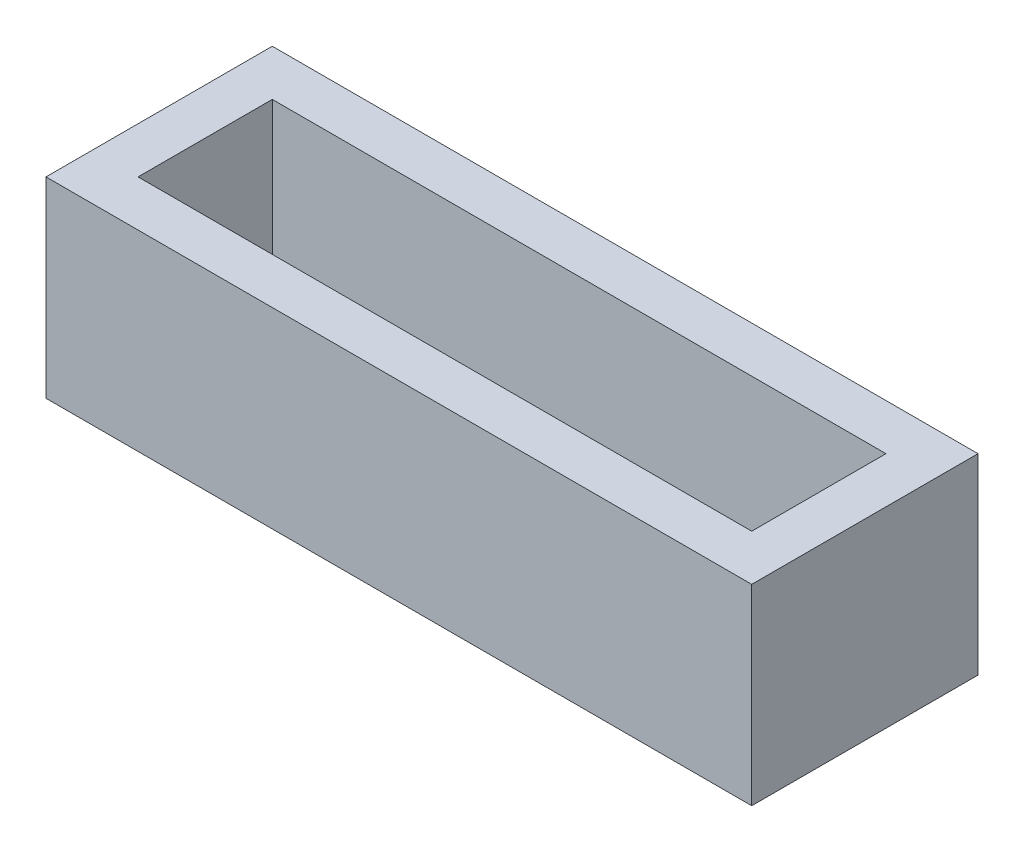
ISO-10303-21;
HEADER;
FILE_DESCRIPTION(('STEP AP214'),'2;1');
FILE_NAME('part.step','',(''),(''),'','','');
FILE_SCHEMA(('AUTOMOTIVE_DESIGN { 1 0 10303 214 1 1 1 1 }'));
ENDSEC;
DATA;
#1=APPLICATION_CONTEXT('core data for automotive mechanical design processes');
#2=APPLICATION_PROTOCOL_DEFINITION('international standard','automotive_design',2000,#1);
#3=PRODUCT_CONTEXT('',#1,'mechanical');
#4=PRODUCT('Part','Part','',(#3));
#5=PRODUCT_RELATED_PRODUCT_CATEGORY('part','',(#4));
#6=PRODUCT_DEFINITION_FORMATION('','',#4);
#7=PRODUCT_DEFINITION_CONTEXT('part definition',#1,'design');
#8=PRODUCT_DEFINITION('design','',#6,#7);
#9=PRODUCT_DEFINITION_SHAPE('','',#8);
#10=(LENGTH_UNIT() NAMED_UNIT(*) SI_UNIT(.MILLI.,.METRE.));
#11=(NAMED_UNIT(*) PLANE_ANGLE_UNIT() SI_UNIT($,.RADIAN.));
#12=(NAMED_UNIT(*) SI_UNIT($,.STERADIAN.) SOLID_ANGLE_UNIT());
#13=UNCERTAINTY_MEASURE_WITH_UNIT(LENGTH_MEASURE(1.E-05),#10,'distance_accuracy_value','');
#14=(GEOMETRIC_REPRESENTATION_CONTEXT(3) GLOBAL_UNCERTAINTY_ASSIGNED_CONTEXT((#13)) GLOBAL_UNIT_ASSIGNED_CONTEXT((#10,
#11,#12)) REPRESENTATION_CONTEXT('',''));
#15=CARTESIAN_POINT('',(0.,0.,0.));
#16=DIRECTION('',(0.,0.,1.));
#17=DIRECTION('',(1.,0.,0.));
#18=AXIS2_PLACEMENT_3D('',#15,#16,#17);
#19=CARTESIAN_POINT('',(0.,5.,0.));
#20=DIRECTION('',(0.,-1.,0.));
#21=DIRECTION('',(0.,0.,-1.));
#22=AXIS2_PLACEMENT_3D('',#19,#20,#21);
#23=PLANE('',#22);
#24=DIRECTION('',(-1.,0.,0.));
#25=VECTOR('',#24,1.);
#26=CARTESIAN_POINT('',(-9.2,5.,-2.95));
#27=LINE('',#26,#25);
#28=CARTESIAN_POINT('',(9.19999999999999,5.,-2.95));
#29=VERTEX_POINT('',#28);
#30=CARTESIAN_POINT('',(-9.2,5.,-2.95));
#31=VERTEX_POINT('',#30);
#32=EDGE_CURVE('E153',#29,#31,#27,.T.);
#33=ORIENTED_EDGE('',*,*,#32,.T.);
#34=DIRECTION('',(0.,0.,1.));
#35=VECTOR('',#34,1.);
#36=CARTESIAN_POINT('',(-9.2,5.,-2.95));
#37=LINE('',#36,#35);
#38=CARTESIAN_POINT('',(-9.2,5.,2.95));
#39=VERTEX_POINT('',#38);
#40=EDGE_CURVE('E157',#31,#39,#37,.T.);
#41=ORIENTED_EDGE('',*,*,#40,.T.);
#42=DIRECTION('',(1.,0.,0.));
#43=VECTOR('',#42,1.);
#44=CARTESIAN_POINT('',(-9.2,5.,2.95));
#45=LINE('',#44,#43);
#46=CARTESIAN_POINT('',(9.19999999999999,5.,2.95));
#47=VERTEX_POINT('',#46);
#48=EDGE_CURVE('E161',#39,#47,#45,.T.);
#49=ORIENTED_EDGE('',*,*,#48,.T.);
#50=DIRECTION('',(0.,0.,-1.));
#51=VECTOR('',#50,1.);
#52=CARTESIAN_POINT('',(9.19999999999999,5.,-2.95));
#53=LINE('',#52,#51);
#54=EDGE_CURVE('E164',#47,#29,#53,.T.);
#55=ORIENTED_EDGE('',*,*,#54,.T.);
#56=EDGE_LOOP('',(#33,#41,#49,#55));
#57=FACE_BOUND('',#56,.T.);
#58=DIRECTION('',(0.,0.,-1.));
#59=VECTOR('',#58,1.);
#60=CARTESIAN_POINT('',(7.99999999999999,5.,-1.75));
#61=LINE('',#60,#59);
#62=CARTESIAN_POINT('',(7.99999999999999,5.,1.75));
#63=VERTEX_POINT('',#62);
#64=CARTESIAN_POINT('',(7.99999999999999,5.,-1.75));
#65=VERTEX_POINT('',#64);
#66=EDGE_CURVE('E105',#63,#65,#61,.T.);
#67=ORIENTED_EDGE('',*,*,#66,.F.);
#68=DIRECTION('',(1.,0.,0.));
#69=VECTOR('',#68,1.);
#70=CARTESIAN_POINT('',(-8.,5.,1.75));
#71=LINE('',#70,#69);
#72=CARTESIAN_POINT('',(-8.,5.,1.75));
#73=VERTEX_POINT('',#72);
#74=EDGE_CURVE('E131',#73,#63,#71,.T.);
#75=ORIENTED_EDGE('',*,*,#74,.F.);
#76=DIRECTION('',(0.,0.,1.));
#77=VECTOR('',#76,1.);
#78=CARTESIAN_POINT('',(-8.,5.,-1.75));
#79=LINE('',#78,#77);
#80=CARTESIAN_POINT('',(-8.,5.,-1.75));
#81=VERTEX_POINT('',#80);
#82=EDGE_CURVE('E127',#81,#73,#79,.T.);
#83=ORIENTED_EDGE('',*,*,#82,.F.);
#84=DIRECTION('',(-1.,0.,0.));
#85=VECTOR('',#84,1.);
#86=CARTESIAN_POINT('',(-8.,5.,-1.75));
#87=LINE('',#86,#85);
#88=EDGE_CURVE('E114',#65,#81,#87,.T.);
#89=ORIENTED_EDGE('',*,*,#88,.F.);
#90=EDGE_LOOP('',(#67,#75,#83,#89));
#91=FACE_BOUND('',#90,.T.);
#92=ADVANCED_FACE('F39',(#57,#91),#23,.F.);
#93=CARTESIAN_POINT('',(0.,0.,0.));
#94=DIRECTION('',(0.,-1.,0.));
#95=DIRECTION('',(0.,0.,-1.));
#96=AXIS2_PLACEMENT_3D('',#93,#94,#95);
#97=PLANE('',#96);
#98=DIRECTION('',(-1.,0.,0.));
#99=VECTOR('',#98,1.);
#100=CARTESIAN_POINT('',(-9.2,0.,-2.95));
#101=LINE('',#100,#99);
#102=CARTESIAN_POINT('',(9.19999999999999,0.,-2.95));
#103=VERTEX_POINT('',#102);
#104=CARTESIAN_POINT('',(-9.2,0.,-2.95));
#105=VERTEX_POINT('',#104);
#106=EDGE_CURVE('E123',#103,#105,#101,.T.);
#107=ORIENTED_EDGE('',*,*,#106,.F.);
#108=DIRECTION('',(0.,0.,-1.));
#109=VECTOR('',#108,1.);
#110=CARTESIAN_POINT('',(9.19999999999999,0.,-2.95));
#111=LINE('',#110,#109);
#112=CARTESIAN_POINT('',(9.19999999999999,0.,2.95));
#113=VERTEX_POINT('',#112);
#114=EDGE_CURVE('E158',#113,#103,#111,.T.);
#115=ORIENTED_EDGE('',*,*,#114,.F.);
#116=DIRECTION('',(1.,0.,0.));
#117=VECTOR('',#116,1.);
#118=CARTESIAN_POINT('',(-9.2,0.,2.95));
#119=LINE('',#118,#117);
#120=CARTESIAN_POINT('',(-9.2,0.,2.95));
#121=VERTEX_POINT('',#120);
#122=EDGE_CURVE('E174',#121,#113,#119,.T.);
#123=ORIENTED_EDGE('',*,*,#122,.F.);
#124=DIRECTION('',(0.,0.,1.));
#125=VECTOR('',#124,1.);
#126=CARTESIAN_POINT('',(-9.2,0.,-2.95));
#127=LINE('',#126,#125);
#128=EDGE_CURVE('E171',#105,#121,#127,.T.);
#129=ORIENTED_EDGE('',*,*,#128,.F.);
#130=EDGE_LOOP('',(#107,#115,#123,#129));
#131=FACE_BOUND('',#130,.T.);
#132=DIRECTION('',(1.,0.,0.));
#133=VECTOR('',#132,1.);
#134=CARTESIAN_POINT('',(-8.,0.,1.75));
#135=LINE('',#134,#133);
#136=CARTESIAN_POINT('',(-8.,0.,1.75));
#137=VERTEX_POINT('',#136);
#138=CARTESIAN_POINT('',(7.99999999999999,0.,1.75));
#139=VERTEX_POINT('',#138);
#140=EDGE_CURVE('E115',#137,#139,#135,.T.);
#141=ORIENTED_EDGE('',*,*,#140,.T.);
#142=DIRECTION('',(0.,0.,-1.));
#143=VECTOR('',#142,1.);
#144=CARTESIAN_POINT('',(7.99999999999999,0.,-1.75));
#145=LINE('',#144,#143);
#146=CARTESIAN_POINT('',(7.99999999999999,0.,-1.75));
#147=VERTEX_POINT('',#146);
#148=EDGE_CURVE('E63',#139,#147,#145,.T.);
#149=ORIENTED_EDGE('',*,*,#148,.T.);
#150=DIRECTION('',(-1.,0.,0.));
#151=VECTOR('',#150,1.);
#152=CARTESIAN_POINT('',(-8.,0.,-1.75));
#153=LINE('',#152,#151);
#154=CARTESIAN_POINT('',(-8.,0.,-1.75));
#155=VERTEX_POINT('',#154);
#156=EDGE_CURVE('E121',#147,#155,#153,.T.);
#157=ORIENTED_EDGE('',*,*,#156,.T.);
#158=DIRECTION('',(0.,0.,1.));
#159=VECTOR('',#158,1.);
#160=CARTESIAN_POINT('',(-8.,0.,-1.75));
#161=LINE('',#160,#159);
#162=EDGE_CURVE('E140',#155,#137,#161,.T.);
#163=ORIENTED_EDGE('',*,*,#162,.T.);
#164=EDGE_LOOP('',(#141,#149,#157,#163));
#165=FACE_BOUND('',#164,.T.);
#166=ADVANCED_FACE('F197',(#131,#165),#97,.T.);
#167=CARTESIAN_POINT('',(-9.2,5.,-2.95));
#168=DIRECTION('',(0.,0.,1.));
#169=DIRECTION('',(1.,0.,0.));
#170=AXIS2_PLACEMENT_3D('',#167,#168,#169);
#171=PLANE('',#170);
#172=ORIENTED_EDGE('',*,*,#106,.T.);
#173=DIRECTION('',(0.,-1.,0.));
#174=VECTOR('',#173,1.);
#175=CARTESIAN_POINT('',(-9.2,5.,-2.95));
#176=LINE('',#175,#174);
#177=EDGE_CURVE('E11',#31,#105,#176,.T.);
#178=ORIENTED_EDGE('',*,*,#177,.F.);
#179=ORIENTED_EDGE('',*,*,#32,.F.);
#180=DIRECTION('',(0.,-1.,0.));
#181=VECTOR('',#180,1.);
#182=CARTESIAN_POINT('',(9.19999999999999,5.,-2.95));
#183=LINE('',#182,#181);
#184=EDGE_CURVE('E167',#29,#103,#183,.T.);
#185=ORIENTED_EDGE('',*,*,#184,.T.);
#186=EDGE_LOOP('',(#172,#178,#179,#185));
#187=FACE_BOUND('',#186,.T.);
#188=ADVANCED_FACE('F41',(#187),#171,.F.);
#189=CARTESIAN_POINT('',(-9.2,5.,-2.95));
#190=DIRECTION('',(1.,0.,0.));
#191=DIRECTION('',(0.,0.,-1.));
#192=AXIS2_PLACEMENT_3D('',#189,#190,#191);
#193=PLANE('',#192);
#194=ORIENTED_EDGE('',*,*,#128,.T.);
#195=DIRECTION('',(0.,-1.,0.));
#196=VECTOR('',#195,1.);
#197=CARTESIAN_POINT('',(-9.2,5.,2.95));
#198=LINE('',#197,#196);
#199=EDGE_CURVE('E48',#39,#121,#198,.T.);
#200=ORIENTED_EDGE('',*,*,#199,.F.);
#201=ORIENTED_EDGE('',*,*,#40,.F.);
#202=ORIENTED_EDGE('',*,*,#177,.T.);
#203=EDGE_LOOP('',(#194,#200,#201,#202));
#204=FACE_BOUND('',#203,.T.);
#205=ADVANCED_FACE('F207',(#204),#193,.F.);
#206=CARTESIAN_POINT('',(-9.2,5.,2.95));
#207=DIRECTION('',(0.,0.,-1.));
#208=DIRECTION('',(-1.,0.,0.));
#209=AXIS2_PLACEMENT_3D('',#206,#207,#208);
#210=PLANE('',#209);
#211=ORIENTED_EDGE('',*,*,#122,.T.);
#212=DIRECTION('',(0.,-1.,0.));
#213=VECTOR('',#212,1.);
#214=CARTESIAN_POINT('',(9.19999999999999,5.,2.95));
#215=LINE('',#214,#213);
#216=EDGE_CURVE('E182',#47,#113,#215,.T.);
#217=ORIENTED_EDGE('',*,*,#216,.F.);
#218=ORIENTED_EDGE('',*,*,#48,.F.);
#219=ORIENTED_EDGE('',*,*,#199,.T.);
#220=EDGE_LOOP('',(#211,#217,#218,#219));
#221=FACE_BOUND('',#220,.T.);
#222=ADVANCED_FACE('F191',(#221),#210,.F.);
#223=CARTESIAN_POINT('',(9.19999999999999,5.,-2.95));
#224=DIRECTION('',(-1.,0.,0.));
#225=DIRECTION('',(0.,0.,1.));
#226=AXIS2_PLACEMENT_3D('',#223,#224,#225);
#227=PLANE('',#226);
#228=ORIENTED_EDGE('',*,*,#114,.T.);
#229=ORIENTED_EDGE('',*,*,#184,.F.);
#230=ORIENTED_EDGE('',*,*,#54,.F.);
#231=ORIENTED_EDGE('',*,*,#216,.T.);
#232=EDGE_LOOP('',(#228,#229,#230,#231));
#233=FACE_BOUND('',#232,.T.);
#234=ADVANCED_FACE('F201',(#233),#227,.F.);
#235=CARTESIAN_POINT('',(7.99999999999999,5.,-1.75));
#236=DIRECTION('',(-1.,0.,0.));
#237=DIRECTION('',(0.,0.,1.));
#238=AXIS2_PLACEMENT_3D('',#235,#236,#237);
#239=PLANE('',#238);
#240=ORIENTED_EDGE('',*,*,#148,.F.);
#241=DIRECTION('',(0.,-1.,0.));
#242=VECTOR('',#241,1.);
#243=CARTESIAN_POINT('',(7.99999999999999,5.,1.75));
#244=LINE('',#243,#242);
#245=EDGE_CURVE('E109',#63,#139,#244,.T.);
#246=ORIENTED_EDGE('',*,*,#245,.F.);
#247=ORIENTED_EDGE('',*,*,#66,.T.);
#248=DIRECTION('',(0.,-1.,0.));
#249=VECTOR('',#248,1.);
#250=CARTESIAN_POINT('',(7.99999999999999,5.,-1.75));
#251=LINE('',#250,#249);
#252=EDGE_CURVE('E108',#65,#147,#251,.T.);
#253=ORIENTED_EDGE('',*,*,#252,.T.);
#254=EDGE_LOOP('',(#240,#246,#247,#253));
#255=FACE_BOUND('',#254,.T.);
#256=ADVANCED_FACE('F107',(#255),#239,.T.);
#257=CARTESIAN_POINT('',(-8.,5.,-1.75));
#258=DIRECTION('',(0.,0.,1.));
#259=DIRECTION('',(1.,0.,0.));
#260=AXIS2_PLACEMENT_3D('',#257,#258,#259);
#261=PLANE('',#260);
#262=ORIENTED_EDGE('',*,*,#156,.F.);
#263=ORIENTED_EDGE('',*,*,#252,.F.);
#264=ORIENTED_EDGE('',*,*,#88,.T.);
#265=DIRECTION('',(0.,-1.,0.));
#266=VECTOR('',#265,1.);
#267=CARTESIAN_POINT('',(-8.,5.,-1.75));
#268=LINE('',#267,#266);
#269=EDGE_CURVE('E124',#81,#155,#268,.T.);
#270=ORIENTED_EDGE('',*,*,#269,.T.);
#271=EDGE_LOOP('',(#262,#263,#264,#270));
#272=FACE_BOUND('',#271,.T.);
#273=ADVANCED_FACE('F118',(#272),#261,.T.);
#274=CARTESIAN_POINT('',(-8.,5.,-1.75));
#275=DIRECTION('',(1.,0.,0.));
#276=DIRECTION('',(0.,0.,-1.));
#277=AXIS2_PLACEMENT_3D('',#274,#275,#276);
#278=PLANE('',#277);
#279=ORIENTED_EDGE('',*,*,#162,.F.);
#280=ORIENTED_EDGE('',*,*,#269,.F.);
#281=ORIENTED_EDGE('',*,*,#82,.T.);
#282=DIRECTION('',(0.,-1.,0.));
#283=VECTOR('',#282,1.);
#284=CARTESIAN_POINT('',(-8.,5.,1.75));
#285=LINE('',#284,#283);
#286=EDGE_CURVE('E55',#73,#137,#285,.T.);
#287=ORIENTED_EDGE('',*,*,#286,.T.);
#288=EDGE_LOOP('',(#279,#280,#281,#287));
#289=FACE_BOUND('',#288,.T.);
#290=ADVANCED_FACE('F230',(#289),#278,.T.);
#291=CARTESIAN_POINT('',(-8.,5.,1.75));
#292=DIRECTION('',(0.,0.,-1.));
#293=DIRECTION('',(-1.,0.,0.));
#294=AXIS2_PLACEMENT_3D('',#291,#292,#293);
#295=PLANE('',#294);
#296=ORIENTED_EDGE('',*,*,#140,.F.);
#297=ORIENTED_EDGE('',*,*,#286,.F.);
#298=ORIENTED_EDGE('',*,*,#74,.T.);
#299=ORIENTED_EDGE('',*,*,#245,.T.);
#300=EDGE_LOOP('',(#296,#297,#298,#299));
#301=FACE_BOUND('',#300,.T.);
#302=ADVANCED_FACE('F234',(#301),#295,.T.);
#303=CLOSED_SHELL('',(#92,#166,#188,#205,#222,#234,#256,#273,#290,#302));
#304=MANIFOLD_SOLID_BREP('B2',#303);
#305=ADVANCED_BREP_SHAPE_REPRESENTATION('',(#18,#304),#14);
#306=SHAPE_DEFINITION_REPRESENTATION(#9,#305);
ENDSEC;
END-ISO-10303-21;
